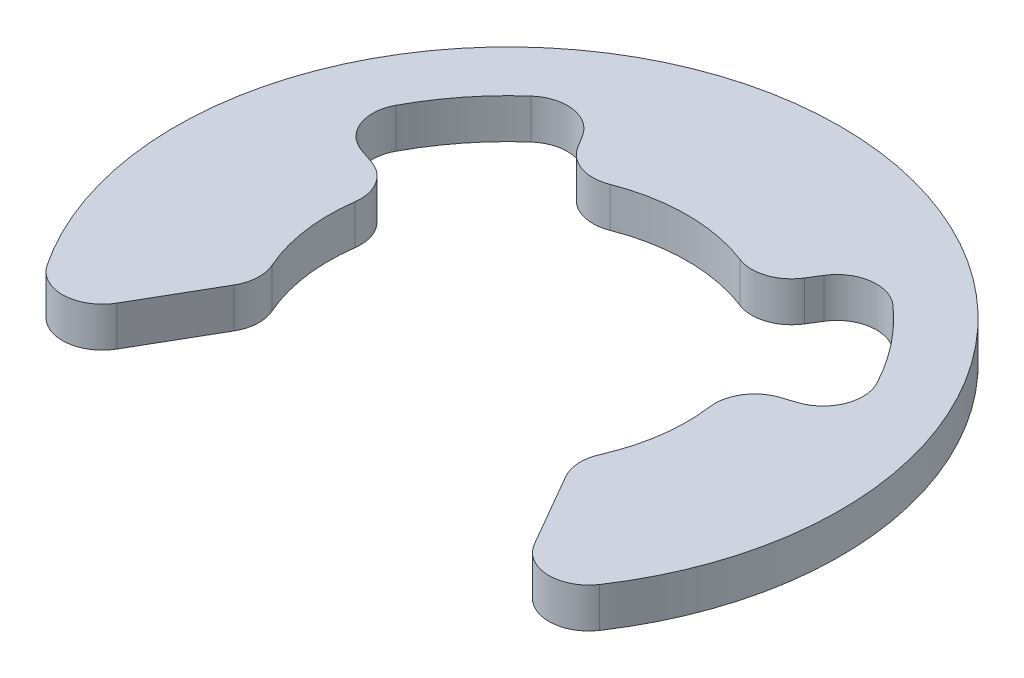
ISO-10303-21;
HEADER;
FILE_DESCRIPTION(('STEP AP214'),'2;1');
FILE_NAME('part.step','',(''),(''),'','','');
FILE_SCHEMA(('AUTOMOTIVE_DESIGN { 1 0 10303 214 1 1 1 1 }'));
ENDSEC;
DATA;
#1=APPLICATION_CONTEXT('core data for automotive mechanical design processes');
#2=APPLICATION_PROTOCOL_DEFINITION('international standard','automotive_design',2000,#1);
#3=PRODUCT_CONTEXT('',#1,'mechanical');
#4=PRODUCT('Part','Part','',(#3));
#5=PRODUCT_RELATED_PRODUCT_CATEGORY('part','',(#4));
#6=PRODUCT_DEFINITION_FORMATION('','',#4);
#7=PRODUCT_DEFINITION_CONTEXT('part definition',#1,'design');
#8=PRODUCT_DEFINITION('design','',#6,#7);
#9=PRODUCT_DEFINITION_SHAPE('','',#8);
#10=(LENGTH_UNIT() NAMED_UNIT(*) SI_UNIT(.MILLI.,.METRE.));
#11=(NAMED_UNIT(*) PLANE_ANGLE_UNIT() SI_UNIT($,.RADIAN.));
#12=(NAMED_UNIT(*) SI_UNIT($,.STERADIAN.) SOLID_ANGLE_UNIT());
#13=UNCERTAINTY_MEASURE_WITH_UNIT(LENGTH_MEASURE(1.E-05),#10,'distance_accuracy_value','');
#14=(GEOMETRIC_REPRESENTATION_CONTEXT(3) GLOBAL_UNCERTAINTY_ASSIGNED_CONTEXT((#13)) GLOBAL_UNIT_ASSIGNED_CONTEXT((#10,
#11,#12)) REPRESENTATION_CONTEXT('',''));
#15=CARTESIAN_POINT('',(0.,0.,0.));
#16=DIRECTION('',(0.,0.,1.));
#17=DIRECTION('',(1.,0.,0.));
#18=AXIS2_PLACEMENT_3D('',#15,#16,#17);
#19=CARTESIAN_POINT('',(-6.11079250706934,-0.5,4.08420309675526));
#20=DIRECTION('',(0.,1.,0.));
#21=DIRECTION('',(0.,0.,1.));
#22=AXIS2_PLACEMENT_3D('',#19,#20,#21);
#23=CYLINDRICAL_SURFACE('',#22,0.999999999999997);
#24=CARTESIAN_POINT('',(-6.11079250706934,0.5,4.08420309675526));
#25=DIRECTION('',(0.,1.,0.));
#26=DIRECTION('',(0.,0.,1.));
#27=AXIS2_PLACEMENT_3D('',#24,#25,#26);
#28=CIRCLE('',#27,0.999999999999997);
#29=CARTESIAN_POINT('',(-6.9421928481672,0.5,4.63987698747027));
#30=VERTEX_POINT('',#29);
#31=CARTESIAN_POINT('',(-5.2447671032849,0.5,4.58420309675526));
#32=VERTEX_POINT('',#31);
#33=EDGE_CURVE('E229',#30,#32,#28,.T.);
#34=ORIENTED_EDGE('',*,*,#33,.F.);
#35=DIRECTION('',(0.,1.,0.));
#36=VECTOR('',#35,1.);
#37=CARTESIAN_POINT('',(-6.9421928481672,-0.5,4.63987698747027));
#38=LINE('',#37,#36);
#39=CARTESIAN_POINT('',(-6.9421928481672,-0.5,4.63987698747027));
#40=VERTEX_POINT('',#39);
#41=EDGE_CURVE('E11',#40,#30,#38,.T.);
#42=ORIENTED_EDGE('',*,*,#41,.F.);
#43=CARTESIAN_POINT('',(-6.11079250706934,-0.5,4.08420309675526));
#44=DIRECTION('',(0.,1.,0.));
#45=DIRECTION('',(0.,0.,1.));
#46=AXIS2_PLACEMENT_3D('',#43,#44,#45);
#47=CIRCLE('',#46,0.999999999999997);
#48=CARTESIAN_POINT('',(-5.2447671032849,-0.5,4.58420309675526));
#49=VERTEX_POINT('',#48);
#50=EDGE_CURVE('E297',#40,#49,#47,.T.);
#51=ORIENTED_EDGE('',*,*,#50,.T.);
#52=DIRECTION('',(0.,1.,0.));
#53=VECTOR('',#52,1.);
#54=CARTESIAN_POINT('',(-5.2447671032849,-0.5,4.58420309675526));
#55=LINE('',#54,#53);
#56=EDGE_CURVE('E39',#49,#32,#55,.T.);
#57=ORIENTED_EDGE('',*,*,#56,.T.);
#58=EDGE_LOOP('',(#34,#42,#51,#57));
#59=FACE_BOUND('',#58,.T.);
#60=ADVANCED_FACE('F36',(#59),#23,.T.);
#61=CARTESIAN_POINT('',(0.,-0.5,0.));
#62=DIRECTION('',(0.,1.,0.));
#63=DIRECTION('',(0.,0.,1.));
#64=AXIS2_PLACEMENT_3D('',#61,#62,#63);
#65=CYLINDRICAL_SURFACE('',#64,8.35);
#66=CARTESIAN_POINT('',(0.,0.5,0.));
#67=DIRECTION('',(0.,1.,0.));
#68=DIRECTION('',(0.,0.,1.));
#69=AXIS2_PLACEMENT_3D('',#66,#67,#68);
#70=CIRCLE('',#69,8.35);
#71=CARTESIAN_POINT('',(6.9421928481672,0.5,4.63987698747026));
#72=VERTEX_POINT('',#71);
#73=EDGE_CURVE('E295',#72,#30,#70,.T.);
#74=ORIENTED_EDGE('',*,*,#73,.F.);
#75=DIRECTION('',(0.,1.,0.));
#76=VECTOR('',#75,1.);
#77=CARTESIAN_POINT('',(6.9421928481672,-0.5,4.63987698747026));
#78=LINE('',#77,#76);
#79=CARTESIAN_POINT('',(6.9421928481672,-0.5,4.63987698747026));
#80=VERTEX_POINT('',#79);
#81=EDGE_CURVE('E45',#80,#72,#78,.T.);
#82=ORIENTED_EDGE('',*,*,#81,.F.);
#83=CARTESIAN_POINT('',(0.,-0.5,0.));
#84=DIRECTION('',(0.,1.,0.));
#85=DIRECTION('',(0.,0.,1.));
#86=AXIS2_PLACEMENT_3D('',#83,#84,#85);
#87=CIRCLE('',#86,8.35);
#88=EDGE_CURVE('E219',#80,#40,#87,.T.);
#89=ORIENTED_EDGE('',*,*,#88,.T.);
#90=ORIENTED_EDGE('',*,*,#41,.T.);
#91=EDGE_LOOP('',(#74,#82,#89,#90));
#92=FACE_BOUND('',#91,.T.);
#93=ADVANCED_FACE('F341',(#92),#65,.T.);
#94=CARTESIAN_POINT('',(6.11079250706934,-0.5,4.08420309675526));
#95=DIRECTION('',(0.,1.,0.));
#96=DIRECTION('',(0.,0.,1.));
#97=AXIS2_PLACEMENT_3D('',#94,#95,#96);
#98=CYLINDRICAL_SURFACE('',#97,0.999999999999992);
#99=CARTESIAN_POINT('',(6.11079250706934,0.5,4.08420309675526));
#100=DIRECTION('',(0.,1.,0.));
#101=DIRECTION('',(0.,0.,1.));
#102=AXIS2_PLACEMENT_3D('',#99,#100,#101);
#103=CIRCLE('',#102,0.999999999999992);
#104=CARTESIAN_POINT('',(5.24476710328491,0.5,4.58420309675526));
#105=VERTEX_POINT('',#104);
#106=EDGE_CURVE('E206',#105,#72,#103,.T.);
#107=ORIENTED_EDGE('',*,*,#106,.F.);
#108=DIRECTION('',(0.,1.,0.));
#109=VECTOR('',#108,1.);
#110=CARTESIAN_POINT('',(5.24476710328491,-0.5,4.58420309675526));
#111=LINE('',#110,#109);
#112=CARTESIAN_POINT('',(5.24476710328491,-0.5,4.58420309675526));
#113=VERTEX_POINT('',#112);
#114=EDGE_CURVE('E201',#113,#105,#111,.T.);
#115=ORIENTED_EDGE('',*,*,#114,.F.);
#116=CARTESIAN_POINT('',(6.11079250706934,-0.5,4.08420309675526));
#117=DIRECTION('',(0.,1.,0.));
#118=DIRECTION('',(0.,0.,1.));
#119=AXIS2_PLACEMENT_3D('',#116,#117,#118);
#120=CIRCLE('',#119,0.999999999999992);
#121=EDGE_CURVE('E204',#113,#80,#120,.T.);
#122=ORIENTED_EDGE('',*,*,#121,.T.);
#123=ORIENTED_EDGE('',*,*,#81,.T.);
#124=EDGE_LOOP('',(#107,#115,#122,#123));
#125=FACE_BOUND('',#124,.T.);
#126=ADVANCED_FACE('F203',(#125),#98,.T.);
#127=CARTESIAN_POINT('',(4.16708707717735,-0.5,2.71760653723484));
#128=DIRECTION('',(-0.866025403784436,0.,0.500000000000004));
#129=DIRECTION('',(0.500000000000004,0.,0.866025403784436));
#130=AXIS2_PLACEMENT_3D('',#127,#128,#129);
#131=PLANE('',#130);
#132=DIRECTION('',(0.500000000000004,0.,0.866025403784436));
#133=VECTOR('',#132,1.);
#134=CARTESIAN_POINT('',(4.16708707717735,0.5,2.71760653723484));
#135=LINE('',#134,#133);
#136=CARTESIAN_POINT('',(4.16708707717735,0.5,2.71760653723484));
#137=VERTEX_POINT('',#136);
#138=EDGE_CURVE('E292',#137,#105,#135,.T.);
#139=ORIENTED_EDGE('',*,*,#138,.F.);
#140=DIRECTION('',(0.,1.,0.));
#141=VECTOR('',#140,1.);
#142=CARTESIAN_POINT('',(4.16708707717735,-0.5,2.71760653723484));
#143=LINE('',#142,#141);
#144=CARTESIAN_POINT('',(4.16708707717735,-0.5,2.71760653723484));
#145=VERTEX_POINT('',#144);
#146=EDGE_CURVE('E211',#145,#137,#143,.T.);
#147=ORIENTED_EDGE('',*,*,#146,.F.);
#148=DIRECTION('',(0.500000000000004,0.,0.866025403784436));
#149=VECTOR('',#148,1.);
#150=CARTESIAN_POINT('',(4.16708707717735,-0.5,2.71760653723484));
#151=LINE('',#150,#149);
#152=EDGE_CURVE('E217',#145,#113,#151,.T.);
#153=ORIENTED_EDGE('',*,*,#152,.T.);
#154=ORIENTED_EDGE('',*,*,#114,.T.);
#155=EDGE_LOOP('',(#139,#147,#153,#154));
#156=FACE_BOUND('',#155,.T.);
#157=ADVANCED_FACE('F221',(#156),#131,.T.);
#158=CARTESIAN_POINT('',(5.03311248096179,-0.5,2.21760653723484));
#159=DIRECTION('',(0.,1.,0.));
#160=DIRECTION('',(0.,0.,1.));
#161=AXIS2_PLACEMENT_3D('',#158,#159,#160);
#162=CYLINDRICAL_SURFACE('',#161,1.);
#163=CARTESIAN_POINT('',(5.03311248096179,0.5,2.21760653723484));
#164=DIRECTION('',(0.,1.,0.));
#165=DIRECTION('',(0.,0.,1.));
#166=AXIS2_PLACEMENT_3D('',#163,#164,#165);
#167=CIRCLE('',#166,1.);
#168=CARTESIAN_POINT('',(4.11800112078692,0.5,1.81440534864668));
#169=VERTEX_POINT('',#168);
#170=EDGE_CURVE('E289',#169,#137,#167,.T.);
#171=ORIENTED_EDGE('',*,*,#170,.F.);
#172=DIRECTION('',(0.,1.,0.));
#173=VECTOR('',#172,1.);
#174=CARTESIAN_POINT('',(4.11800112078692,-0.5,1.81440534864668));
#175=LINE('',#174,#173);
#176=CARTESIAN_POINT('',(4.11800112078692,-0.5,1.81440534864668));
#177=VERTEX_POINT('',#176);
#178=EDGE_CURVE('E301',#177,#169,#175,.T.);
#179=ORIENTED_EDGE('',*,*,#178,.F.);
#180=CARTESIAN_POINT('',(5.03311248096179,-0.5,2.21760653723484));
#181=DIRECTION('',(0.,1.,0.));
#182=DIRECTION('',(0.,0.,1.));
#183=AXIS2_PLACEMENT_3D('',#180,#181,#182);
#184=CIRCLE('',#183,1.);
#185=EDGE_CURVE('E222',#177,#145,#184,.T.);
#186=ORIENTED_EDGE('',*,*,#185,.T.);
#187=ORIENTED_EDGE('',*,*,#146,.T.);
#188=EDGE_LOOP('',(#171,#179,#186,#187));
#189=FACE_BOUND('',#188,.T.);
#190=ADVANCED_FACE('F354',(#189),#162,.T.);
#191=CARTESIAN_POINT('',(0.,-0.5,0.));
#192=DIRECTION('',(0.,1.,0.));
#193=DIRECTION('',(0.,0.,1.));
#194=AXIS2_PLACEMENT_3D('',#191,#192,#193);
#195=CYLINDRICAL_SURFACE('',#194,4.5);
#196=CARTESIAN_POINT('',(0.,0.5,0.));
#197=DIRECTION('',(0.,-1.,0.));
#198=DIRECTION('',(0.,0.,-1.));
#199=AXIS2_PLACEMENT_3D('',#196,#197,#198);
#200=CIRCLE('',#199,4.5);
#201=CARTESIAN_POINT('',(4.45860960941982,0.5,-0.608933781941235));
#202=VERTEX_POINT('',#201);
#203=EDGE_CURVE('E286',#202,#169,#200,.T.);
#204=ORIENTED_EDGE('',*,*,#203,.F.);
#205=DIRECTION('',(0.,1.,0.));
#206=VECTOR('',#205,1.);
#207=CARTESIAN_POINT('',(4.45860960941982,-0.5,-0.608933781941235));
#208=LINE('',#207,#206);
#209=CARTESIAN_POINT('',(4.45860960941982,-0.5,-0.608933781941235));
#210=VERTEX_POINT('',#209);
#211=EDGE_CURVE('E303',#210,#202,#208,.T.);
#212=ORIENTED_EDGE('',*,*,#211,.F.);
#213=CARTESIAN_POINT('',(0.,-0.5,0.));
#214=DIRECTION('',(0.,-1.,0.));
#215=DIRECTION('',(0.,0.,-1.));
#216=AXIS2_PLACEMENT_3D('',#213,#214,#215);
#217=CIRCLE('',#216,4.5);
#218=EDGE_CURVE('E224',#210,#177,#217,.T.);
#219=ORIENTED_EDGE('',*,*,#218,.T.);
#220=ORIENTED_EDGE('',*,*,#178,.T.);
#221=EDGE_LOOP('',(#204,#212,#219,#220));
#222=FACE_BOUND('',#221,.T.);
#223=ADVANCED_FACE('F357',(#222),#195,.F.);
#224=CARTESIAN_POINT('',(5.44941174484645,-0.5,-0.744252400150397));
#225=DIRECTION('',(0.,1.,0.));
#226=DIRECTION('',(0.,0.,1.));
#227=AXIS2_PLACEMENT_3D('',#224,#225,#226);
#228=CYLINDRICAL_SURFACE('',#227,1.);
#229=CARTESIAN_POINT('',(5.44941174484645,0.5,-0.744252400150397));
#230=DIRECTION('',(0.,1.,0.));
#231=DIRECTION('',(0.,0.,1.));
#232=AXIS2_PLACEMENT_3D('',#229,#230,#231);
#233=CIRCLE('',#232,1.);
#234=CARTESIAN_POINT('',(5.13620275209304,0.5,-1.69393662496326));
#235=VERTEX_POINT('',#234);
#236=EDGE_CURVE('E283',#235,#202,#233,.T.);
#237=ORIENTED_EDGE('',*,*,#236,.F.);
#238=DIRECTION('',(0.,1.,0.));
#239=VECTOR('',#238,1.);
#240=CARTESIAN_POINT('',(5.13620275209304,-0.5,-1.69393662496326));
#241=LINE('',#240,#239);
#242=CARTESIAN_POINT('',(5.13620275209304,-0.5,-1.69393662496326));
#243=VERTEX_POINT('',#242);
#244=EDGE_CURVE('E305',#243,#235,#241,.T.);
#245=ORIENTED_EDGE('',*,*,#244,.F.);
#246=CARTESIAN_POINT('',(5.44941174484645,-0.5,-0.744252400150397));
#247=DIRECTION('',(0.,1.,0.));
#248=DIRECTION('',(0.,0.,1.));
#249=AXIS2_PLACEMENT_3D('',#246,#247,#248);
#250=CIRCLE('',#249,1.);
#251=EDGE_CURVE('E647',#243,#210,#250,.T.);
#252=ORIENTED_EDGE('',*,*,#251,.T.);
#253=ORIENTED_EDGE('',*,*,#211,.T.);
#254=EDGE_LOOP('',(#237,#245,#252,#253));
#255=FACE_BOUND('',#254,.T.);
#256=ADVANCED_FACE('F361',(#255),#228,.T.);
#257=CARTESIAN_POINT('',(5.47388134366768,-0.5,-1.80530413932028));
#258=DIRECTION('',(-0.313208992753405,0.,-0.949684224812857));
#259=DIRECTION('',(-0.949684224812857,0.,0.313208992753405));
#260=AXIS2_PLACEMENT_3D('',#257,#258,#259);
#261=PLANE('',#260);
#262=DIRECTION('',(-0.949684224812857,0.,0.313208992753405));
#263=VECTOR('',#262,1.);
#264=CARTESIAN_POINT('',(5.47388134366768,0.5,-1.80530413932028));
#265=LINE('',#264,#263);
#266=CARTESIAN_POINT('',(5.47388134366768,0.5,-1.80530413932028));
#267=VERTEX_POINT('',#266);
#268=EDGE_CURVE('E280',#267,#235,#265,.T.);
#269=ORIENTED_EDGE('',*,*,#268,.F.);
#270=DIRECTION('',(0.,1.,0.));
#271=VECTOR('',#270,1.);
#272=CARTESIAN_POINT('',(5.47388134366768,-0.5,-1.80530413932028));
#273=LINE('',#272,#271);
#274=CARTESIAN_POINT('',(5.47388134366768,-0.5,-1.80530413932028));
#275=VERTEX_POINT('',#274);
#276=EDGE_CURVE('E307',#275,#267,#273,.T.);
#277=ORIENTED_EDGE('',*,*,#276,.F.);
#278=DIRECTION('',(-0.949684224812857,0.,0.313208992753405));
#279=VECTOR('',#278,1.);
#280=CARTESIAN_POINT('',(5.47388134366768,-0.5,-1.80530413932028));
#281=LINE('',#280,#279);
#282=EDGE_CURVE('E651',#275,#243,#281,.T.);
#283=ORIENTED_EDGE('',*,*,#282,.T.);
#284=ORIENTED_EDGE('',*,*,#244,.T.);
#285=EDGE_LOOP('',(#269,#277,#283,#284));
#286=FACE_BOUND('',#285,.T.);
#287=ADVANCED_FACE('F365',(#286),#261,.T.);
#288=CARTESIAN_POINT('',(5.16067235091428,-0.5,-2.75498836413313));
#289=DIRECTION('',(0.,1.,0.));
#290=DIRECTION('',(0.,0.,1.));
#291=AXIS2_PLACEMENT_3D('',#288,#289,#290);
#292=CYLINDRICAL_SURFACE('',#291,0.999999999999994);
#293=CARTESIAN_POINT('',(5.16067235091428,0.5,-2.75498836413313));
#294=DIRECTION('',(0.,-1.,0.));
#295=DIRECTION('',(0.,0.,-1.));
#296=AXIS2_PLACEMENT_3D('',#293,#294,#295);
#297=CIRCLE('',#296,0.999999999999994);
#298=CARTESIAN_POINT('',(6.04283856474577,0.5,-3.22592654603623));
#299=VERTEX_POINT('',#298);
#300=EDGE_CURVE('E277',#299,#267,#297,.T.);
#301=ORIENTED_EDGE('',*,*,#300,.F.);
#302=DIRECTION('',(0.,1.,0.));
#303=VECTOR('',#302,1.);
#304=CARTESIAN_POINT('',(6.04283856474577,-0.5,-3.22592654603623));
#305=LINE('',#304,#303);
#306=CARTESIAN_POINT('',(6.04283856474577,-0.5,-3.22592654603623));
#307=VERTEX_POINT('',#306);
#308=EDGE_CURVE('E309',#307,#299,#305,.T.);
#309=ORIENTED_EDGE('',*,*,#308,.F.);
#310=CARTESIAN_POINT('',(5.16067235091428,-0.5,-2.75498836413313));
#311=DIRECTION('',(0.,-1.,0.));
#312=DIRECTION('',(0.,0.,-1.));
#313=AXIS2_PLACEMENT_3D('',#310,#311,#312);
#314=CIRCLE('',#313,0.999999999999994);
#315=EDGE_CURVE('E640',#307,#275,#314,.T.);
#316=ORIENTED_EDGE('',*,*,#315,.T.);
#317=ORIENTED_EDGE('',*,*,#276,.T.);
#318=EDGE_LOOP('',(#301,#309,#316,#317));
#319=FACE_BOUND('',#318,.T.);
#320=ADVANCED_FACE('F369',(#319),#292,.F.);
#321=CARTESIAN_POINT('',(0.,-0.5,0.));
#322=DIRECTION('',(0.,1.,0.));
#323=DIRECTION('',(0.,0.,1.));
#324=AXIS2_PLACEMENT_3D('',#321,#322,#323);
#325=CYLINDRICAL_SURFACE('',#324,6.85);
#326=CARTESIAN_POINT('',(0.,0.5,0.));
#327=DIRECTION('',(0.,-1.,0.));
#328=DIRECTION('',(0.,0.,-1.));
#329=AXIS2_PLACEMENT_3D('',#326,#327,#328);
#330=CIRCLE('',#329,6.85);
#331=CARTESIAN_POINT('',(4.54697908095998,0.5,-5.123229571014));
#332=VERTEX_POINT('',#331);
#333=EDGE_CURVE('E274',#332,#299,#330,.T.);
#334=ORIENTED_EDGE('',*,*,#333,.F.);
#335=DIRECTION('',(0.,1.,0.));
#336=VECTOR('',#335,1.);
#337=CARTESIAN_POINT('',(4.54697908095998,-0.5,-5.123229571014));
#338=LINE('',#337,#336);
#339=CARTESIAN_POINT('',(4.54697908095998,-0.5,-5.123229571014));
#340=VERTEX_POINT('',#339);
#341=EDGE_CURVE('E311',#340,#332,#338,.T.);
#342=ORIENTED_EDGE('',*,*,#341,.F.);
#343=CARTESIAN_POINT('',(0.,-0.5,0.));
#344=DIRECTION('',(0.,-1.,0.));
#345=DIRECTION('',(0.,0.,-1.));
#346=AXIS2_PLACEMENT_3D('',#343,#344,#345);
#347=CIRCLE('',#346,6.85);
#348=EDGE_CURVE('E636',#340,#307,#347,.T.);
#349=ORIENTED_EDGE('',*,*,#348,.T.);
#350=ORIENTED_EDGE('',*,*,#308,.T.);
#351=EDGE_LOOP('',(#334,#342,#349,#350));
#352=FACE_BOUND('',#351,.T.);
#353=ADVANCED_FACE('F373',(#352),#325,.F.);
#354=CARTESIAN_POINT('',(3.88318651439648,-0.5,-4.37531284531853));
#355=DIRECTION('',(0.,1.,0.));
#356=DIRECTION('',(0.,0.,1.));
#357=AXIS2_PLACEMENT_3D('',#354,#355,#356);
#358=CYLINDRICAL_SURFACE('',#357,0.999999999999997);
#359=CARTESIAN_POINT('',(3.88318651439648,0.5,-4.37531284531853));
#360=DIRECTION('',(0.,-1.,0.));
#361=DIRECTION('',(0.,0.,-1.));
#362=AXIS2_PLACEMENT_3D('',#359,#360,#361);
#363=CIRCLE('',#362,0.999999999999997);
#364=CARTESIAN_POINT('',(3.03280925313837,0.5,-4.90148630866988));
#365=VERTEX_POINT('',#364);
#366=EDGE_CURVE('E271',#365,#332,#363,.T.);
#367=ORIENTED_EDGE('',*,*,#366,.F.);
#368=DIRECTION('',(0.,1.,0.));
#369=VECTOR('',#368,1.);
#370=CARTESIAN_POINT('',(3.03280925313837,-0.5,-4.90148630866988));
#371=LINE('',#370,#369);
#372=CARTESIAN_POINT('',(3.03280925313837,-0.5,-4.90148630866988));
#373=VERTEX_POINT('',#372);
#374=EDGE_CURVE('E313',#373,#365,#371,.T.);
#375=ORIENTED_EDGE('',*,*,#374,.F.);
#376=CARTESIAN_POINT('',(3.88318651439648,-0.5,-4.37531284531853));
#377=DIRECTION('',(0.,-1.,0.));
#378=DIRECTION('',(0.,0.,-1.));
#379=AXIS2_PLACEMENT_3D('',#376,#377,#378);
#380=CIRCLE('',#379,0.999999999999997);
#381=EDGE_CURVE('E657',#373,#340,#380,.T.);
#382=ORIENTED_EDGE('',*,*,#381,.T.);
#383=ORIENTED_EDGE('',*,*,#341,.T.);
#384=EDGE_LOOP('',(#367,#375,#382,#383));
#385=FACE_BOUND('',#384,.T.);
#386=ADVANCED_FACE('F377',(#385),#358,.F.);
#387=CARTESIAN_POINT('',(2.84571810285266,-0.5,-4.59911822843213));
#388=DIRECTION('',(0.850377261258111,0.,0.526173463351351));
#389=DIRECTION('',(0.526173463351351,0.,-0.850377261258111));
#390=AXIS2_PLACEMENT_3D('',#387,#388,#389);
#391=PLANE('',#390);
#392=DIRECTION('',(0.526173463351351,0.,-0.850377261258111));
#393=VECTOR('',#392,1.);
#394=CARTESIAN_POINT('',(2.84571810285266,0.5,-4.59911822843213));
#395=LINE('',#394,#393);
#396=CARTESIAN_POINT('',(2.84571810285266,0.5,-4.59911822843213));
#397=VERTEX_POINT('',#396);
#398=EDGE_CURVE('E268',#397,#365,#395,.T.);
#399=ORIENTED_EDGE('',*,*,#398,.F.);
#400=DIRECTION('',(0.,1.,0.));
#401=VECTOR('',#400,1.);
#402=CARTESIAN_POINT('',(2.84571810285266,-0.5,-4.59911822843213));
#403=LINE('',#402,#401);
#404=CARTESIAN_POINT('',(2.84571810285266,-0.5,-4.59911822843213));
#405=VERTEX_POINT('',#404);
#406=EDGE_CURVE('E315',#405,#397,#403,.T.);
#407=ORIENTED_EDGE('',*,*,#406,.F.);
#408=DIRECTION('',(0.526173463351351,0.,-0.850377261258111));
#409=VECTOR('',#408,1.);
#410=CARTESIAN_POINT('',(2.84571810285266,-0.5,-4.59911822843213));
#411=LINE('',#410,#409);
#412=EDGE_CURVE('E629',#405,#373,#411,.T.);
#413=ORIENTED_EDGE('',*,*,#412,.T.);
#414=ORIENTED_EDGE('',*,*,#374,.T.);
#415=EDGE_LOOP('',(#399,#407,#413,#414));
#416=FACE_BOUND('',#415,.T.);
#417=ADVANCED_FACE('F381',(#416),#391,.T.);
#418=CARTESIAN_POINT('',(1.99534084159454,-0.5,-5.12529169178348));
#419=DIRECTION('',(0.,1.,0.));
#420=DIRECTION('',(0.,0.,1.));
#421=AXIS2_PLACEMENT_3D('',#418,#419,#420);
#422=CYLINDRICAL_SURFACE('',#421,0.999999999999999);
#423=CARTESIAN_POINT('',(1.99534084159454,0.5,-5.12529169178348));
#424=DIRECTION('',(0.,1.,0.));
#425=DIRECTION('',(0.,0.,1.));
#426=AXIS2_PLACEMENT_3D('',#423,#424,#425);
#427=CIRCLE('',#426,0.999999999999999);
#428=CARTESIAN_POINT('',(1.63255159766826,0.5,-4.19342047509558));
#429=VERTEX_POINT('',#428);
#430=EDGE_CURVE('E265',#429,#397,#427,.T.);
#431=ORIENTED_EDGE('',*,*,#430,.F.);
#432=DIRECTION('',(0.,1.,0.));
#433=VECTOR('',#432,1.);
#434=CARTESIAN_POINT('',(1.63255159766826,-0.5,-4.19342047509558));
#435=LINE('',#434,#433);
#436=CARTESIAN_POINT('',(1.63255159766826,-0.5,-4.19342047509558));
#437=VERTEX_POINT('',#436);
#438=EDGE_CURVE('E317',#437,#429,#435,.T.);
#439=ORIENTED_EDGE('',*,*,#438,.F.);
#440=CARTESIAN_POINT('',(1.99534084159454,-0.5,-5.12529169178348));
#441=DIRECTION('',(0.,1.,0.));
#442=DIRECTION('',(0.,0.,1.));
#443=AXIS2_PLACEMENT_3D('',#440,#441,#442);
#444=CIRCLE('',#443,0.999999999999999);
#445=EDGE_CURVE('E625',#437,#405,#444,.T.);
#446=ORIENTED_EDGE('',*,*,#445,.T.);
#447=ORIENTED_EDGE('',*,*,#406,.T.);
#448=EDGE_LOOP('',(#431,#439,#446,#447));
#449=FACE_BOUND('',#448,.T.);
#450=ADVANCED_FACE('F385',(#449),#422,.T.);
#451=CARTESIAN_POINT('',(0.,-0.5,0.));
#452=DIRECTION('',(0.,1.,0.));
#453=DIRECTION('',(0.,0.,1.));
#454=AXIS2_PLACEMENT_3D('',#451,#452,#453);
#455=CYLINDRICAL_SURFACE('',#454,4.5);
#456=CARTESIAN_POINT('',(0.,0.5,0.));
#457=DIRECTION('',(0.,-1.,0.));
#458=DIRECTION('',(0.,0.,-1.));
#459=AXIS2_PLACEMENT_3D('',#456,#457,#458);
#460=CIRCLE('',#459,4.5);
#461=CARTESIAN_POINT('',(-1.63255159766826,0.5,-4.19342047509558));
#462=VERTEX_POINT('',#461);
#463=EDGE_CURVE('E262',#462,#429,#460,.T.);
#464=ORIENTED_EDGE('',*,*,#463,.F.);
#465=DIRECTION('',(0.,1.,0.));
#466=VECTOR('',#465,1.);
#467=CARTESIAN_POINT('',(-1.63255159766826,-0.5,-4.19342047509558));
#468=LINE('',#467,#466);
#469=CARTESIAN_POINT('',(-1.63255159766826,-0.5,-4.19342047509558));
#470=VERTEX_POINT('',#469);
#471=EDGE_CURVE('E319',#470,#462,#468,.T.);
#472=ORIENTED_EDGE('',*,*,#471,.F.);
#473=CARTESIAN_POINT('',(0.,-0.5,0.));
#474=DIRECTION('',(0.,-1.,0.));
#475=DIRECTION('',(0.,0.,-1.));
#476=AXIS2_PLACEMENT_3D('',#473,#474,#475);
#477=CIRCLE('',#476,4.5);
#478=EDGE_CURVE('E661',#470,#437,#477,.T.);
#479=ORIENTED_EDGE('',*,*,#478,.T.);
#480=ORIENTED_EDGE('',*,*,#438,.T.);
#481=EDGE_LOOP('',(#464,#472,#479,#480));
#482=FACE_BOUND('',#481,.T.);
#483=ADVANCED_FACE('F389',(#482),#455,.F.);
#484=CARTESIAN_POINT('',(-1.99534084159454,-0.5,-5.12529169178348));
#485=DIRECTION('',(0.,1.,0.));
#486=DIRECTION('',(0.,0.,1.));
#487=AXIS2_PLACEMENT_3D('',#484,#485,#486);
#488=CYLINDRICAL_SURFACE('',#487,0.999999999999999);
#489=CARTESIAN_POINT('',(-1.99534084159454,0.5,-5.12529169178348));
#490=DIRECTION('',(0.,1.,0.));
#491=DIRECTION('',(0.,0.,1.));
#492=AXIS2_PLACEMENT_3D('',#489,#490,#491);
#493=CIRCLE('',#492,0.999999999999999);
#494=CARTESIAN_POINT('',(-2.84571810285266,0.5,-4.59911822843213));
#495=VERTEX_POINT('',#494);
#496=EDGE_CURVE('E259',#495,#462,#493,.T.);
#497=ORIENTED_EDGE('',*,*,#496,.F.);
#498=DIRECTION('',(0.,1.,0.));
#499=VECTOR('',#498,1.);
#500=CARTESIAN_POINT('',(-2.84571810285266,-0.5,-4.59911822843213));
#501=LINE('',#500,#499);
#502=CARTESIAN_POINT('',(-2.84571810285266,-0.5,-4.59911822843213));
#503=VERTEX_POINT('',#502);
#504=EDGE_CURVE('E321',#503,#495,#501,.T.);
#505=ORIENTED_EDGE('',*,*,#504,.F.);
#506=CARTESIAN_POINT('',(-1.99534084159454,-0.5,-5.12529169178348));
#507=DIRECTION('',(0.,1.,0.));
#508=DIRECTION('',(0.,0.,1.));
#509=AXIS2_PLACEMENT_3D('',#506,#507,#508);
#510=CIRCLE('',#509,0.999999999999999);
#511=EDGE_CURVE('E618',#503,#470,#510,.T.);
#512=ORIENTED_EDGE('',*,*,#511,.T.);
#513=ORIENTED_EDGE('',*,*,#471,.T.);
#514=EDGE_LOOP('',(#497,#505,#512,#513));
#515=FACE_BOUND('',#514,.T.);
#516=ADVANCED_FACE('F393',(#515),#488,.T.);
#517=CARTESIAN_POINT('',(-3.03280925313837,-0.5,-4.90148630866988));
#518=DIRECTION('',(-0.850377261258111,0.,0.526173463351351));
#519=DIRECTION('',(0.526173463351351,0.,0.850377261258111));
#520=AXIS2_PLACEMENT_3D('',#517,#518,#519);
#521=PLANE('',#520);
#522=DIRECTION('',(0.526173463351351,0.,0.850377261258111));
#523=VECTOR('',#522,1.);
#524=CARTESIAN_POINT('',(-3.03280925313837,0.5,-4.90148630866988));
#525=LINE('',#524,#523);
#526=CARTESIAN_POINT('',(-3.03280925313837,0.5,-4.90148630866988));
#527=VERTEX_POINT('',#526);
#528=EDGE_CURVE('E256',#527,#495,#525,.T.);
#529=ORIENTED_EDGE('',*,*,#528,.F.);
#530=DIRECTION('',(0.,1.,0.));
#531=VECTOR('',#530,1.);
#532=CARTESIAN_POINT('',(-3.03280925313837,-0.5,-4.90148630866988));
#533=LINE('',#532,#531);
#534=CARTESIAN_POINT('',(-3.03280925313837,-0.5,-4.90148630866988));
#535=VERTEX_POINT('',#534);
#536=EDGE_CURVE('E323',#535,#527,#533,.T.);
#537=ORIENTED_EDGE('',*,*,#536,.F.);
#538=DIRECTION('',(0.526173463351351,0.,0.850377261258111));
#539=VECTOR('',#538,1.);
#540=CARTESIAN_POINT('',(-3.03280925313837,-0.5,-4.90148630866988));
#541=LINE('',#540,#539);
#542=EDGE_CURVE('E614',#535,#503,#541,.T.);
#543=ORIENTED_EDGE('',*,*,#542,.T.);
#544=ORIENTED_EDGE('',*,*,#504,.T.);
#545=EDGE_LOOP('',(#529,#537,#543,#544));
#546=FACE_BOUND('',#545,.T.);
#547=ADVANCED_FACE('F397',(#546),#521,.T.);
#548=CARTESIAN_POINT('',(-3.88318651439648,-0.5,-4.37531284531853));
#549=DIRECTION('',(0.,1.,0.));
#550=DIRECTION('',(0.,0.,1.));
#551=AXIS2_PLACEMENT_3D('',#548,#549,#550);
#552=CYLINDRICAL_SURFACE('',#551,0.999999999999997);
#553=CARTESIAN_POINT('',(-3.88318651439648,0.5,-4.37531284531853));
#554=DIRECTION('',(0.,-1.,0.));
#555=DIRECTION('',(0.,0.,-1.));
#556=AXIS2_PLACEMENT_3D('',#553,#554,#555);
#557=CIRCLE('',#556,0.999999999999997);
#558=CARTESIAN_POINT('',(-4.54697908095998,0.5,-5.123229571014));
#559=VERTEX_POINT('',#558);
#560=EDGE_CURVE('E253',#559,#527,#557,.T.);
#561=ORIENTED_EDGE('',*,*,#560,.F.);
#562=DIRECTION('',(0.,1.,0.));
#563=VECTOR('',#562,1.);
#564=CARTESIAN_POINT('',(-4.54697908095998,-0.5,-5.123229571014));
#565=LINE('',#564,#563);
#566=CARTESIAN_POINT('',(-4.54697908095998,-0.5,-5.123229571014));
#567=VERTEX_POINT('',#566);
#568=EDGE_CURVE('E325',#567,#559,#565,.T.);
#569=ORIENTED_EDGE('',*,*,#568,.F.);
#570=CARTESIAN_POINT('',(-3.88318651439648,-0.5,-4.37531284531853));
#571=DIRECTION('',(0.,-1.,0.));
#572=DIRECTION('',(0.,0.,-1.));
#573=AXIS2_PLACEMENT_3D('',#570,#571,#572);
#574=CIRCLE('',#573,0.999999999999997);
#575=EDGE_CURVE('E665',#567,#535,#574,.T.);
#576=ORIENTED_EDGE('',*,*,#575,.T.);
#577=ORIENTED_EDGE('',*,*,#536,.T.);
#578=EDGE_LOOP('',(#561,#569,#576,#577));
#579=FACE_BOUND('',#578,.T.);
#580=ADVANCED_FACE('F401',(#579),#552,.F.);
#581=CARTESIAN_POINT('',(0.,-0.5,0.));
#582=DIRECTION('',(0.,1.,0.));
#583=DIRECTION('',(0.,0.,1.));
#584=AXIS2_PLACEMENT_3D('',#581,#582,#583);
#585=CYLINDRICAL_SURFACE('',#584,6.85);
#586=CARTESIAN_POINT('',(0.,0.5,0.));
#587=DIRECTION('',(0.,-1.,0.));
#588=DIRECTION('',(0.,0.,-1.));
#589=AXIS2_PLACEMENT_3D('',#586,#587,#588);
#590=CIRCLE('',#589,6.85);
#591=CARTESIAN_POINT('',(-6.04283856474577,0.5,-3.22592654603623));
#592=VERTEX_POINT('',#591);
#593=EDGE_CURVE('E250',#592,#559,#590,.T.);
#594=ORIENTED_EDGE('',*,*,#593,.F.);
#595=DIRECTION('',(0.,1.,0.));
#596=VECTOR('',#595,1.);
#597=CARTESIAN_POINT('',(-6.04283856474577,-0.5,-3.22592654603623));
#598=LINE('',#597,#596);
#599=CARTESIAN_POINT('',(-6.04283856474577,-0.5,-3.22592654603623));
#600=VERTEX_POINT('',#599);
#601=EDGE_CURVE('E327',#600,#592,#598,.T.);
#602=ORIENTED_EDGE('',*,*,#601,.F.);
#603=CARTESIAN_POINT('',(0.,-0.5,0.));
#604=DIRECTION('',(0.,-1.,0.));
#605=DIRECTION('',(0.,0.,-1.));
#606=AXIS2_PLACEMENT_3D('',#603,#604,#605);
#607=CIRCLE('',#606,6.85);
#608=EDGE_CURVE('E607',#600,#567,#607,.T.);
#609=ORIENTED_EDGE('',*,*,#608,.T.);
#610=ORIENTED_EDGE('',*,*,#568,.T.);
#611=EDGE_LOOP('',(#594,#602,#609,#610));
#612=FACE_BOUND('',#611,.T.);
#613=ADVANCED_FACE('F405',(#612),#585,.F.);
#614=CARTESIAN_POINT('',(-5.16067235091428,-0.5,-2.75498836413313));
#615=DIRECTION('',(0.,1.,0.));
#616=DIRECTION('',(0.,0.,1.));
#617=AXIS2_PLACEMENT_3D('',#614,#615,#616);
#618=CYLINDRICAL_SURFACE('',#617,0.999999999999994);
#619=CARTESIAN_POINT('',(-5.16067235091428,0.5,-2.75498836413313));
#620=DIRECTION('',(0.,-1.,0.));
#621=DIRECTION('',(0.,0.,-1.));
#622=AXIS2_PLACEMENT_3D('',#619,#620,#621);
#623=CIRCLE('',#622,0.999999999999994);
#624=CARTESIAN_POINT('',(-5.47388134366768,0.5,-1.80530413932028));
#625=VERTEX_POINT('',#624);
#626=EDGE_CURVE('E247',#625,#592,#623,.T.);
#627=ORIENTED_EDGE('',*,*,#626,.F.);
#628=DIRECTION('',(0.,1.,0.));
#629=VECTOR('',#628,1.);
#630=CARTESIAN_POINT('',(-5.47388134366768,-0.5,-1.80530413932028));
#631=LINE('',#630,#629);
#632=CARTESIAN_POINT('',(-5.47388134366768,-0.5,-1.80530413932028));
#633=VERTEX_POINT('',#632);
#634=EDGE_CURVE('E329',#633,#625,#631,.T.);
#635=ORIENTED_EDGE('',*,*,#634,.F.);
#636=CARTESIAN_POINT('',(-5.16067235091428,-0.5,-2.75498836413313));
#637=DIRECTION('',(0.,-1.,0.));
#638=DIRECTION('',(0.,0.,-1.));
#639=AXIS2_PLACEMENT_3D('',#636,#637,#638);
#640=CIRCLE('',#639,0.999999999999994);
#641=EDGE_CURVE('E603',#633,#600,#640,.T.);
#642=ORIENTED_EDGE('',*,*,#641,.T.);
#643=ORIENTED_EDGE('',*,*,#601,.T.);
#644=EDGE_LOOP('',(#627,#635,#642,#643));
#645=FACE_BOUND('',#644,.T.);
#646=ADVANCED_FACE('F409',(#645),#618,.F.);
#647=CARTESIAN_POINT('',(-5.13620275209304,-0.5,-1.69393662496326));
#648=DIRECTION('',(0.313208992753405,0.,-0.949684224812857));
#649=DIRECTION('',(-0.949684224812857,0.,-0.313208992753405));
#650=AXIS2_PLACEMENT_3D('',#647,#648,#649);
#651=PLANE('',#650);
#652=DIRECTION('',(-0.949684224812857,0.,-0.313208992753405));
#653=VECTOR('',#652,1.);
#654=CARTESIAN_POINT('',(-5.13620275209304,0.5,-1.69393662496326));
#655=LINE('',#654,#653);
#656=CARTESIAN_POINT('',(-5.13620275209304,0.5,-1.69393662496326));
#657=VERTEX_POINT('',#656);
#658=EDGE_CURVE('E244',#657,#625,#655,.T.);
#659=ORIENTED_EDGE('',*,*,#658,.F.);
#660=DIRECTION('',(0.,1.,0.));
#661=VECTOR('',#660,1.);
#662=CARTESIAN_POINT('',(-5.13620275209304,-0.5,-1.69393662496326));
#663=LINE('',#662,#661);
#664=CARTESIAN_POINT('',(-5.13620275209304,-0.5,-1.69393662496326));
#665=VERTEX_POINT('',#664);
#666=EDGE_CURVE('E331',#665,#657,#663,.T.);
#667=ORIENTED_EDGE('',*,*,#666,.F.);
#668=DIRECTION('',(-0.949684224812857,0.,-0.313208992753405));
#669=VECTOR('',#668,1.);
#670=CARTESIAN_POINT('',(-5.13620275209304,-0.5,-1.69393662496326));
#671=LINE('',#670,#669);
#672=EDGE_CURVE('E669',#665,#633,#671,.T.);
#673=ORIENTED_EDGE('',*,*,#672,.T.);
#674=ORIENTED_EDGE('',*,*,#634,.T.);
#675=EDGE_LOOP('',(#659,#667,#673,#674));
#676=FACE_BOUND('',#675,.T.);
#677=ADVANCED_FACE('F413',(#676),#651,.T.);
#678=CARTESIAN_POINT('',(-5.44941174484645,-0.5,-0.744252400150397));
#679=DIRECTION('',(0.,1.,0.));
#680=DIRECTION('',(0.,0.,1.));
#681=AXIS2_PLACEMENT_3D('',#678,#679,#680);
#682=CYLINDRICAL_SURFACE('',#681,1.);
#683=CARTESIAN_POINT('',(-5.44941174484645,0.5,-0.744252400150397));
#684=DIRECTION('',(0.,1.,0.));
#685=DIRECTION('',(0.,0.,1.));
#686=AXIS2_PLACEMENT_3D('',#683,#684,#685);
#687=CIRCLE('',#686,1.);
#688=CARTESIAN_POINT('',(-4.45860960941982,0.5,-0.608933781941233));
#689=VERTEX_POINT('',#688);
#690=EDGE_CURVE('E241',#689,#657,#687,.T.);
#691=ORIENTED_EDGE('',*,*,#690,.F.);
#692=DIRECTION('',(0.,1.,0.));
#693=VECTOR('',#692,1.);
#694=CARTESIAN_POINT('',(-4.45860960941982,-0.5,-0.608933781941233));
#695=LINE('',#694,#693);
#696=CARTESIAN_POINT('',(-4.45860960941982,-0.5,-0.608933781941233));
#697=VERTEX_POINT('',#696);
#698=EDGE_CURVE('E333',#697,#689,#695,.T.);
#699=ORIENTED_EDGE('',*,*,#698,.F.);
#700=CARTESIAN_POINT('',(-5.44941174484645,-0.5,-0.744252400150397));
#701=DIRECTION('',(0.,1.,0.));
#702=DIRECTION('',(0.,0.,1.));
#703=AXIS2_PLACEMENT_3D('',#700,#701,#702);
#704=CIRCLE('',#703,1.);
#705=EDGE_CURVE('E596',#697,#665,#704,.T.);
#706=ORIENTED_EDGE('',*,*,#705,.T.);
#707=ORIENTED_EDGE('',*,*,#666,.T.);
#708=EDGE_LOOP('',(#691,#699,#706,#707));
#709=FACE_BOUND('',#708,.T.);
#710=ADVANCED_FACE('F417',(#709),#682,.T.);
#711=CARTESIAN_POINT('',(0.,-0.5,0.));
#712=DIRECTION('',(0.,1.,0.));
#713=DIRECTION('',(0.,0.,1.));
#714=AXIS2_PLACEMENT_3D('',#711,#712,#713);
#715=CYLINDRICAL_SURFACE('',#714,4.5);
#716=CARTESIAN_POINT('',(0.,0.5,0.));
#717=DIRECTION('',(0.,-1.,0.));
#718=DIRECTION('',(0.,0.,-1.));
#719=AXIS2_PLACEMENT_3D('',#716,#717,#718);
#720=CIRCLE('',#719,4.5);
#721=CARTESIAN_POINT('',(-4.11800112078692,0.5,1.81440534864669));
#722=VERTEX_POINT('',#721);
#723=EDGE_CURVE('E238',#722,#689,#720,.T.);
#724=ORIENTED_EDGE('',*,*,#723,.F.);
#725=DIRECTION('',(0.,1.,0.));
#726=VECTOR('',#725,1.);
#727=CARTESIAN_POINT('',(-4.11800112078692,-0.5,1.81440534864669));
#728=LINE('',#727,#726);
#729=CARTESIAN_POINT('',(-4.11800112078692,-0.5,1.81440534864669));
#730=VERTEX_POINT('',#729);
#731=EDGE_CURVE('E335',#730,#722,#728,.T.);
#732=ORIENTED_EDGE('',*,*,#731,.F.);
#733=CARTESIAN_POINT('',(0.,-0.5,0.));
#734=DIRECTION('',(0.,-1.,0.));
#735=DIRECTION('',(0.,0.,-1.));
#736=AXIS2_PLACEMENT_3D('',#733,#734,#735);
#737=CIRCLE('',#736,4.5);
#738=EDGE_CURVE('E592',#730,#697,#737,.T.);
#739=ORIENTED_EDGE('',*,*,#738,.T.);
#740=ORIENTED_EDGE('',*,*,#698,.T.);
#741=EDGE_LOOP('',(#724,#732,#739,#740));
#742=FACE_BOUND('',#741,.T.);
#743=ADVANCED_FACE('F421',(#742),#715,.F.);
#744=CARTESIAN_POINT('',(-5.03311248096179,-0.5,2.21760653723484));
#745=DIRECTION('',(0.,1.,0.));
#746=DIRECTION('',(0.,0.,1.));
#747=AXIS2_PLACEMENT_3D('',#744,#745,#746);
#748=CYLINDRICAL_SURFACE('',#747,1.);
#749=CARTESIAN_POINT('',(-5.03311248096179,0.5,2.21760653723484));
#750=DIRECTION('',(0.,1.,0.));
#751=DIRECTION('',(0.,0.,1.));
#752=AXIS2_PLACEMENT_3D('',#749,#750,#751);
#753=CIRCLE('',#752,1.);
#754=CARTESIAN_POINT('',(-4.16708707717735,0.5,2.71760653723484));
#755=VERTEX_POINT('',#754);
#756=EDGE_CURVE('E235',#755,#722,#753,.T.);
#757=ORIENTED_EDGE('',*,*,#756,.F.);
#758=DIRECTION('',(0.,1.,0.));
#759=VECTOR('',#758,1.);
#760=CARTESIAN_POINT('',(-4.16708707717735,-0.5,2.71760653723484));
#761=LINE('',#760,#759);
#762=CARTESIAN_POINT('',(-4.16708707717735,-0.5,2.71760653723484));
#763=VERTEX_POINT('',#762);
#764=EDGE_CURVE('E336',#763,#755,#761,.T.);
#765=ORIENTED_EDGE('',*,*,#764,.F.);
#766=CARTESIAN_POINT('',(-5.03311248096179,-0.5,2.21760653723484));
#767=DIRECTION('',(0.,1.,0.));
#768=DIRECTION('',(0.,0.,1.));
#769=AXIS2_PLACEMENT_3D('',#766,#767,#768);
#770=CIRCLE('',#769,1.);
#771=EDGE_CURVE('E673',#763,#730,#770,.T.);
#772=ORIENTED_EDGE('',*,*,#771,.T.);
#773=ORIENTED_EDGE('',*,*,#731,.T.);
#774=EDGE_LOOP('',(#757,#765,#772,#773));
#775=FACE_BOUND('',#774,.T.);
#776=ADVANCED_FACE('F425',(#775),#748,.T.);
#777=CARTESIAN_POINT('',(-5.2447671032849,-0.5,4.58420309675526));
#778=DIRECTION('',(0.866025403784437,0.,0.500000000000002));
#779=DIRECTION('',(0.500000000000002,0.,-0.866025403784437));
#780=AXIS2_PLACEMENT_3D('',#777,#778,#779);
#781=PLANE('',#780);
#782=DIRECTION('',(0.500000000000002,0.,-0.866025403784437));
#783=VECTOR('',#782,1.);
#784=CARTESIAN_POINT('',(-5.2447671032849,0.5,4.58420309675526));
#785=LINE('',#784,#783);
#786=EDGE_CURVE('E232',#32,#755,#785,.T.);
#787=ORIENTED_EDGE('',*,*,#786,.F.);
#788=ORIENTED_EDGE('',*,*,#56,.F.);
#789=DIRECTION('',(0.500000000000002,0.,-0.866025403784437));
#790=VECTOR('',#789,1.);
#791=CARTESIAN_POINT('',(-5.2447671032849,-0.5,4.58420309675526));
#792=LINE('',#791,#790);
#793=EDGE_CURVE('E675',#49,#763,#792,.T.);
#794=ORIENTED_EDGE('',*,*,#793,.T.);
#795=ORIENTED_EDGE('',*,*,#764,.T.);
#796=EDGE_LOOP('',(#787,#788,#794,#795));
#797=FACE_BOUND('',#796,.T.);
#798=ADVANCED_FACE('F338',(#797),#781,.T.);
#799=CARTESIAN_POINT('',(-6.11079250706934,-0.5,4.08420309675526));
#800=DIRECTION('',(0.,1.,0.));
#801=DIRECTION('',(0.,0.,1.));
#802=AXIS2_PLACEMENT_3D('',#799,#800,#801);
#803=PLANE('',#802);
#804=ORIENTED_EDGE('',*,*,#50,.F.);
#805=ORIENTED_EDGE('',*,*,#88,.F.);
#806=ORIENTED_EDGE('',*,*,#121,.F.);
#807=ORIENTED_EDGE('',*,*,#152,.F.);
#808=ORIENTED_EDGE('',*,*,#185,.F.);
#809=ORIENTED_EDGE('',*,*,#218,.F.);
#810=ORIENTED_EDGE('',*,*,#251,.F.);
#811=ORIENTED_EDGE('',*,*,#282,.F.);
#812=ORIENTED_EDGE('',*,*,#315,.F.);
#813=ORIENTED_EDGE('',*,*,#348,.F.);
#814=ORIENTED_EDGE('',*,*,#381,.F.);
#815=ORIENTED_EDGE('',*,*,#412,.F.);
#816=ORIENTED_EDGE('',*,*,#445,.F.);
#817=ORIENTED_EDGE('',*,*,#478,.F.);
#818=ORIENTED_EDGE('',*,*,#511,.F.);
#819=ORIENTED_EDGE('',*,*,#542,.F.);
#820=ORIENTED_EDGE('',*,*,#575,.F.);
#821=ORIENTED_EDGE('',*,*,#608,.F.);
#822=ORIENTED_EDGE('',*,*,#641,.F.);
#823=ORIENTED_EDGE('',*,*,#672,.F.);
#824=ORIENTED_EDGE('',*,*,#705,.F.);
#825=ORIENTED_EDGE('',*,*,#738,.F.);
#826=ORIENTED_EDGE('',*,*,#771,.F.);
#827=ORIENTED_EDGE('',*,*,#793,.F.);
#828=EDGE_LOOP('',(#804,#805,#806,#807,#808,#809,#810,#811,#812,#813,#814,#815,#816,#817,#818,
#819,#820,#821,#822,#823,#824,#825,#826,#827));
#829=FACE_BOUND('',#828,.T.);
#830=ADVANCED_FACE('F215',(#829),#803,.F.);
#831=CARTESIAN_POINT('',(-6.11079250706934,0.5,4.08420309675526));
#832=DIRECTION('',(0.,1.,0.));
#833=DIRECTION('',(0.,0.,1.));
#834=AXIS2_PLACEMENT_3D('',#831,#832,#833);
#835=PLANE('',#834);
#836=ORIENTED_EDGE('',*,*,#33,.T.);
#837=ORIENTED_EDGE('',*,*,#786,.T.);
#838=ORIENTED_EDGE('',*,*,#756,.T.);
#839=ORIENTED_EDGE('',*,*,#723,.T.);
#840=ORIENTED_EDGE('',*,*,#690,.T.);
#841=ORIENTED_EDGE('',*,*,#658,.T.);
#842=ORIENTED_EDGE('',*,*,#626,.T.);
#843=ORIENTED_EDGE('',*,*,#593,.T.);
#844=ORIENTED_EDGE('',*,*,#560,.T.);
#845=ORIENTED_EDGE('',*,*,#528,.T.);
#846=ORIENTED_EDGE('',*,*,#496,.T.);
#847=ORIENTED_EDGE('',*,*,#463,.T.);
#848=ORIENTED_EDGE('',*,*,#430,.T.);
#849=ORIENTED_EDGE('',*,*,#398,.T.);
#850=ORIENTED_EDGE('',*,*,#366,.T.);
#851=ORIENTED_EDGE('',*,*,#333,.T.);
#852=ORIENTED_EDGE('',*,*,#300,.T.);
#853=ORIENTED_EDGE('',*,*,#268,.T.);
#854=ORIENTED_EDGE('',*,*,#236,.T.);
#855=ORIENTED_EDGE('',*,*,#203,.T.);
#856=ORIENTED_EDGE('',*,*,#170,.T.);
#857=ORIENTED_EDGE('',*,*,#138,.T.);
#858=ORIENTED_EDGE('',*,*,#106,.T.);
#859=ORIENTED_EDGE('',*,*,#73,.T.);
#860=EDGE_LOOP('',(#836,#837,#838,#839,#840,#841,#842,#843,#844,#845,#846,#847,#848,#849,#850,
#851,#852,#853,#854,#855,#856,#857,#858,#859));
#861=FACE_BOUND('',#860,.T.);
#862=ADVANCED_FACE('F340',(#861),#835,.T.);
#863=CLOSED_SHELL('',(#60,#93,#126,#157,#190,#223,#256,#287,#320,#353,#386,#417,#450,#483,#516,
#547,#580,#613,#646,#677,#710,#743,#776,#798,#830,#862));
#864=MANIFOLD_SOLID_BREP('B2',#863);
#865=ADVANCED_BREP_SHAPE_REPRESENTATION('',(#18,#864),#14);
#866=SHAPE_DEFINITION_REPRESENTATION(#9,#865);
ENDSEC;
END-ISO-10303-21;
